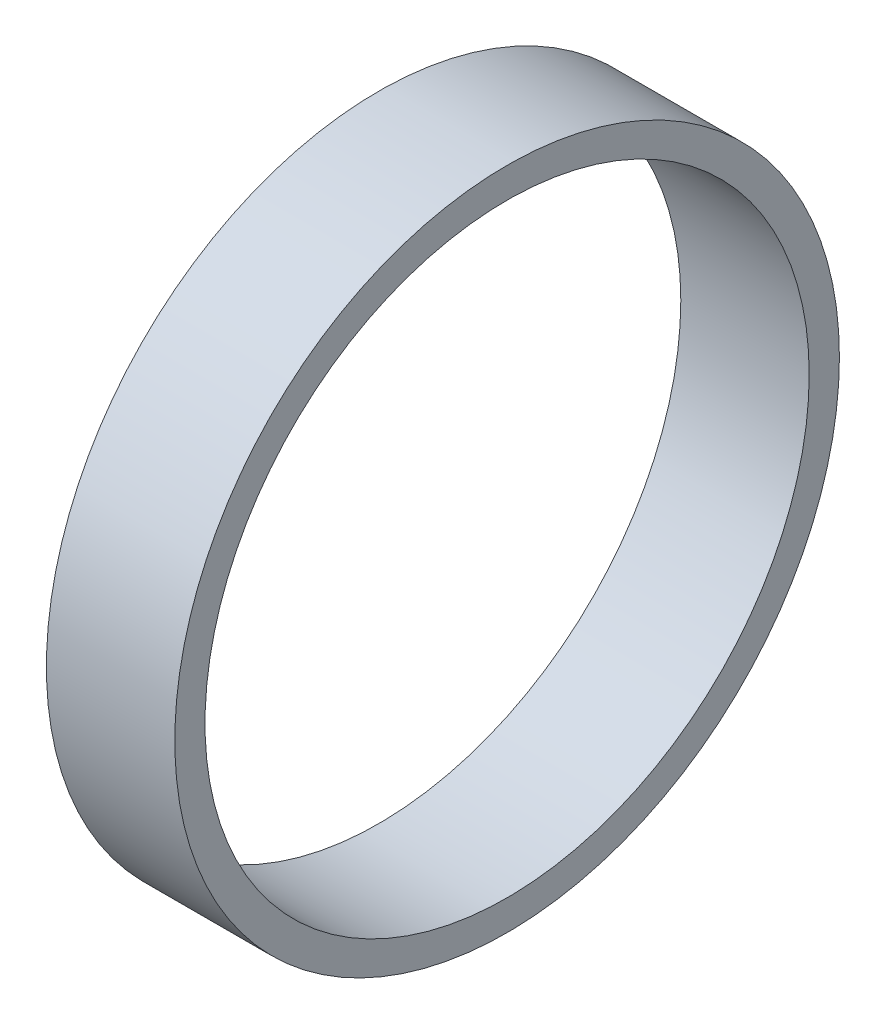
ISO-10303-21;
HEADER;
FILE_DESCRIPTION(('STEP AP214'),'2;1');
FILE_NAME('part.step','',(''),(''),'','','');
FILE_SCHEMA(('AUTOMOTIVE_DESIGN { 1 0 10303 214 1 1 1 1 }'));
ENDSEC;
DATA;
#1=APPLICATION_CONTEXT('core data for automotive mechanical design processes');
#2=APPLICATION_PROTOCOL_DEFINITION('international standard','automotive_design',2000,#1);
#3=PRODUCT_CONTEXT('',#1,'mechanical');
#4=PRODUCT('Part','Part','',(#3));
#5=PRODUCT_RELATED_PRODUCT_CATEGORY('part','',(#4));
#6=PRODUCT_DEFINITION_FORMATION('','',#4);
#7=PRODUCT_DEFINITION_CONTEXT('part definition',#1,'design');
#8=PRODUCT_DEFINITION('design','',#6,#7);
#9=PRODUCT_DEFINITION_SHAPE('','',#8);
#10=(LENGTH_UNIT() NAMED_UNIT(*) SI_UNIT(.MILLI.,.METRE.));
#11=(NAMED_UNIT(*) PLANE_ANGLE_UNIT() SI_UNIT($,.RADIAN.));
#12=(NAMED_UNIT(*) SI_UNIT($,.STERADIAN.) SOLID_ANGLE_UNIT());
#13=UNCERTAINTY_MEASURE_WITH_UNIT(LENGTH_MEASURE(1.E-05),#10,'distance_accuracy_value','');
#14=(GEOMETRIC_REPRESENTATION_CONTEXT(3) GLOBAL_UNCERTAINTY_ASSIGNED_CONTEXT((#13)) GLOBAL_UNIT_ASSIGNED_CONTEXT((#10,
#11,#12)) REPRESENTATION_CONTEXT('',''));
#15=CARTESIAN_POINT('',(0.,0.,0.));
#16=DIRECTION('',(0.,0.,1.));
#17=DIRECTION('',(1.,0.,0.));
#18=AXIS2_PLACEMENT_3D('',#15,#16,#17);
#19=CARTESIAN_POINT('',(4.25,0.,0.));
#20=DIRECTION('',(1.,0.,0.));
#21=DIRECTION('',(0.,0.,-1.));
#22=AXIS2_PLACEMENT_3D('',#19,#20,#21);
#23=PLANE('',#22);
#24=CARTESIAN_POINT('',(4.25,0.,0.));
#25=DIRECTION('',(1.,0.,0.));
#26=DIRECTION('',(0.,0.,-1.));
#27=AXIS2_PLACEMENT_3D('',#24,#25,#26);
#28=CIRCLE('',#27,11.);
#29=CARTESIAN_POINT('',(4.25,0.,-11.));
#30=VERTEX_POINT('',#29);
#31=EDGE_CURVE('E10',#30,#30,#28,.T.);
#32=ORIENTED_EDGE('',*,*,#31,.T.);
#33=EDGE_LOOP('',(#32));
#34=FACE_BOUND('',#33,.T.);
#35=CARTESIAN_POINT('',(4.25,0.,0.));
#36=DIRECTION('',(1.,0.,0.));
#37=DIRECTION('',(0.,0.,-1.));
#38=AXIS2_PLACEMENT_3D('',#35,#36,#37);
#39=CIRCLE('',#38,10.);
#40=CARTESIAN_POINT('',(4.25,0.,-10.));
#41=VERTEX_POINT('',#40);
#42=EDGE_CURVE('E47',#41,#41,#39,.T.);
#43=ORIENTED_EDGE('',*,*,#42,.F.);
#44=EDGE_LOOP('',(#43));
#45=FACE_BOUND('',#44,.T.);
#46=ADVANCED_FACE('F36',(#34,#45),#23,.T.);
#47=CARTESIAN_POINT('',(0.,0.,0.));
#48=DIRECTION('',(1.,0.,0.));
#49=DIRECTION('',(0.,0.,-1.));
#50=AXIS2_PLACEMENT_3D('',#47,#48,#49);
#51=PLANE('',#50);
#52=CARTESIAN_POINT('',(0.,0.,0.));
#53=DIRECTION('',(1.,0.,0.));
#54=DIRECTION('',(0.,0.,-1.));
#55=AXIS2_PLACEMENT_3D('',#52,#53,#54);
#56=CIRCLE('',#55,11.);
#57=CARTESIAN_POINT('',(0.,0.,-11.));
#58=VERTEX_POINT('',#57);
#59=EDGE_CURVE('E40',#58,#58,#56,.T.);
#60=ORIENTED_EDGE('',*,*,#59,.F.);
#61=EDGE_LOOP('',(#60));
#62=FACE_BOUND('',#61,.T.);
#63=CARTESIAN_POINT('',(0.,0.,0.));
#64=DIRECTION('',(1.,0.,0.));
#65=DIRECTION('',(0.,0.,-1.));
#66=AXIS2_PLACEMENT_3D('',#63,#64,#65);
#67=CIRCLE('',#66,10.);
#68=CARTESIAN_POINT('',(0.,0.,-10.));
#69=VERTEX_POINT('',#68);
#70=EDGE_CURVE('E49',#69,#69,#67,.T.);
#71=ORIENTED_EDGE('',*,*,#70,.T.);
#72=EDGE_LOOP('',(#71));
#73=FACE_BOUND('',#72,.T.);
#74=ADVANCED_FACE('F59',(#62,#73),#51,.F.);
#75=CARTESIAN_POINT('',(4.25,0.,0.));
#76=DIRECTION('',(-1.,0.,0.));
#77=DIRECTION('',(0.,0.,1.));
#78=AXIS2_PLACEMENT_3D('',#75,#76,#77);
#79=CYLINDRICAL_SURFACE('',#78,11.);
#80=ORIENTED_EDGE('',*,*,#31,.F.);
#81=EDGE_LOOP('',(#80));
#82=FACE_BOUND('',#81,.T.);
#83=ORIENTED_EDGE('',*,*,#59,.T.);
#84=EDGE_LOOP('',(#83));
#85=FACE_BOUND('',#84,.T.);
#86=ADVANCED_FACE('F38',(#82,#85),#79,.T.);
#87=CARTESIAN_POINT('',(4.25,0.,0.));
#88=DIRECTION('',(-1.,0.,0.));
#89=DIRECTION('',(0.,0.,1.));
#90=AXIS2_PLACEMENT_3D('',#87,#88,#89);
#91=CYLINDRICAL_SURFACE('',#90,10.);
#92=ORIENTED_EDGE('',*,*,#42,.T.);
#93=EDGE_LOOP('',(#92));
#94=FACE_BOUND('',#93,.T.);
#95=ORIENTED_EDGE('',*,*,#70,.F.);
#96=EDGE_LOOP('',(#95));
#97=FACE_BOUND('',#96,.T.);
#98=ADVANCED_FACE('F55',(#94,#97),#91,.F.);
#99=CLOSED_SHELL('',(#46,#74,#86,#98));
#100=MANIFOLD_SOLID_BREP('B2',#99);
#101=ADVANCED_BREP_SHAPE_REPRESENTATION('',(#18,#100),#14);
#102=SHAPE_DEFINITION_REPRESENTATION(#9,#101);
ENDSEC;
END-ISO-10303-21;
